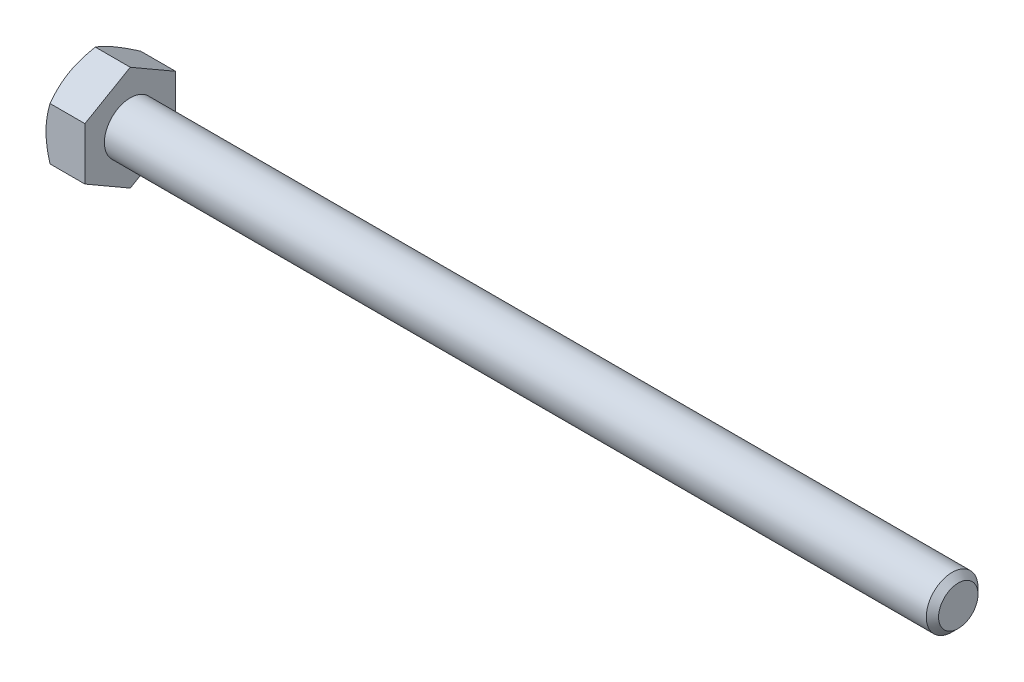
ISO-10303-21;
HEADER;
FILE_DESCRIPTION(('STEP AP214'),'2;1');
FILE_NAME('part.step','',(''),(''),'','','');
FILE_SCHEMA(('AUTOMOTIVE_DESIGN { 1 0 10303 214 1 1 1 1 }'));
ENDSEC;
DATA;
#1=APPLICATION_CONTEXT('core data for automotive mechanical design processes');
#2=APPLICATION_PROTOCOL_DEFINITION('international standard','automotive_design',2000,#1);
#3=PRODUCT_CONTEXT('',#1,'mechanical');
#4=PRODUCT('Part','Part','',(#3));
#5=PRODUCT_RELATED_PRODUCT_CATEGORY('part','',(#4));
#6=PRODUCT_DEFINITION_FORMATION('','',#4);
#7=PRODUCT_DEFINITION_CONTEXT('part definition',#1,'design');
#8=PRODUCT_DEFINITION('design','',#6,#7);
#9=PRODUCT_DEFINITION_SHAPE('','',#8);
#10=(LENGTH_UNIT() NAMED_UNIT(*) SI_UNIT(.MILLI.,.METRE.));
#11=(NAMED_UNIT(*) PLANE_ANGLE_UNIT() SI_UNIT($,.RADIAN.));
#12=(NAMED_UNIT(*) SI_UNIT($,.STERADIAN.) SOLID_ANGLE_UNIT());
#13=UNCERTAINTY_MEASURE_WITH_UNIT(LENGTH_MEASURE(1.E-05),#10,'distance_accuracy_value','');
#14=(GEOMETRIC_REPRESENTATION_CONTEXT(3) GLOBAL_UNCERTAINTY_ASSIGNED_CONTEXT((#13)) GLOBAL_UNIT_ASSIGNED_CONTEXT((#10,
#11,#12)) REPRESENTATION_CONTEXT('',''));
#15=CARTESIAN_POINT('',(0.,0.,0.));
#16=DIRECTION('',(0.,0.,1.));
#17=DIRECTION('',(1.,0.,0.));
#18=AXIS2_PLACEMENT_3D('',#15,#16,#17);
#19=CARTESIAN_POINT('',(4.7752,3.21156860739421,-5.5626));
#20=DIRECTION('',(0.,-0.866025403784438,0.500000000000001));
#21=DIRECTION('',(0.,-0.500000000000002,-0.866025403784438));
#22=AXIS2_PLACEMENT_3D('',#19,#20,#21);
#23=PLANE('',#22);
#24=CARTESIAN_POINT('',(0.496898061070145,6.42325268484227,0.0002));
#25=CARTESIAN_POINT('',(0.456146202255132,6.35265858120791,-0.122072574209491));
#26=CARTESIAN_POINT('',(0.417243775308724,6.2818012683745,-0.244801040124762));
#27=CARTESIAN_POINT('',(0.343647161560544,6.13951120287093,-0.491254662989244));
#28=CARTESIAN_POINT('',(0.308954790139046,6.06807821602766,-0.614980225538198));
#29=CARTESIAN_POINT('',(0.211873701066857,5.8526355064814,-0.988137944592621));
#30=CARTESIAN_POINT('',(0.156654841923374,5.70777535201369,-1.23904309212296));
#31=CARTESIAN_POINT('',(0.0919037861815295,5.49099476252076,-1.61451808721946));
#32=CARTESIAN_POINT('',(0.0734579983429358,5.419722058732,-1.7379660313744));
#33=CARTESIAN_POINT('',(0.0425268916674639,5.27685459691415,-1.98541973399132));
#34=CARTESIAN_POINT('',(0.03004104618901,5.20525986790489,-2.10942544218948));
#35=CARTESIAN_POINT('',(0.0113480299394723,5.06194605565758,-2.35765224642821));
#36=CARTESIAN_POINT('',(0.00513373340584859,4.9902272065059,-2.48187293701928));
#37=CARTESIAN_POINT('',(-0.000889599359094047,4.84672720555796,-2.7304222295473));
#38=CARTESIAN_POINT('',(-0.000698833448294769,4.7749460557547,-2.85475082803225));
#39=CARTESIAN_POINT('',(0.00862810136342433,4.57828637012706,-3.19537539533985));
#40=CARTESIAN_POINT('',(0.0242873955350771,4.4534722013835,-3.41155987710816));
#41=CARTESIAN_POINT('',(0.0739443233816063,4.20467287416474,-3.84249295274001));
#42=CARTESIAN_POINT('',(0.107958931423459,4.08068859075412,-4.05724003094723));
#43=CARTESIAN_POINT('',(0.192986041409677,3.83138850679899,-4.4890404426887));
#44=CARTESIAN_POINT('',(0.244358813937401,3.70610416511176,-4.70603928788379));
#45=CARTESIAN_POINT('',(0.360954456999594,3.45740388365365,-5.13680081122592));
#46=CARTESIAN_POINT('',(0.426149937617058,3.33398475856357,-5.35056900650764));
#47=CARTESIAN_POINT('',(0.496898061070138,3.21145313734037,-5.5628));
#48=B_SPLINE_CURVE_WITH_KNOTS('',3,(#24,#25,#26,#27,#28,#29,#30,#31,#32,#33,#34,#35,#36,#37,#38,
#39,#40,#41,#42,#43,#44,#45,#46,#47),.UNSPECIFIED.,.F.,.F.,(4,2,2,2,2,2,2,2,2,2,2,4),(0.,
0.440820118562271,0.881829648847401,1.76568130465017,2.19678242164486,2.62784543796583,
3.05841812523868,3.48897751176353,4.23854798324166,4.9888128227567,5.75571809391027,
6.52111769989992),.UNSPECIFIED.);
#49=CARTESIAN_POINT('',(0.49683139260579,6.42313721478843,0.));
#50=VERTEX_POINT('',#49);
#51=CARTESIAN_POINT('',(0.,4.81735291109131,-2.78130000000001));
#52=VERTEX_POINT('',#51);
#53=EDGE_CURVE('E47',#50,#52,#48,.T.);
#54=ORIENTED_EDGE('',*,*,#53,.F.);
#55=DIRECTION('',(-1.,0.,0.));
#56=VECTOR('',#55,1.);
#57=CARTESIAN_POINT('',(4.7752,6.42313721478843,0.));
#58=LINE('',#57,#56);
#59=CARTESIAN_POINT('',(4.7752,6.42313721478843,0.));
#60=VERTEX_POINT('',#59);
#61=EDGE_CURVE('E143',#60,#50,#58,.T.);
#62=ORIENTED_EDGE('',*,*,#61,.F.);
#63=DIRECTION('',(0.,0.500000000000001,0.866025403784438));
#64=VECTOR('',#63,1.);
#65=CARTESIAN_POINT('',(4.7752,3.21156860739421,-5.5626));
#66=LINE('',#65,#64);
#67=CARTESIAN_POINT('',(4.7752,3.21156860739421,-5.5626));
#68=VERTEX_POINT('',#67);
#69=EDGE_CURVE('E228',#68,#60,#66,.T.);
#70=ORIENTED_EDGE('',*,*,#69,.F.);
#71=DIRECTION('',(-1.,0.,0.));
#72=VECTOR('',#71,1.);
#73=CARTESIAN_POINT('',(4.7752,3.21156860739421,-5.5626));
#74=LINE('',#73,#72);
#75=CARTESIAN_POINT('',(0.496831392605783,3.21156860739421,-5.5626));
#76=VERTEX_POINT('',#75);
#77=EDGE_CURVE('E131',#68,#76,#74,.T.);
#78=ORIENTED_EDGE('',*,*,#77,.T.);
#79=EDGE_CURVE('E125',#52,#76,#48,.T.);
#80=ORIENTED_EDGE('',*,*,#79,.F.);
#81=EDGE_LOOP('',(#54,#62,#70,#78,#80));
#82=FACE_BOUND('',#81,.T.);
#83=ADVANCED_FACE('F31',(#82),#23,.F.);
#84=CARTESIAN_POINT('',(4.7752,6.42313721478843,0.));
#85=DIRECTION('',(0.,-0.866025403784438,-0.500000000000002));
#86=DIRECTION('',(0.,0.500000000000002,-0.866025403784438));
#87=AXIS2_PLACEMENT_3D('',#84,#85,#86);
#88=PLANE('',#87);
#89=CARTESIAN_POINT('',(0.496898061070137,3.21145313734037,5.5628));
#90=CARTESIAN_POINT('',(0.456146202255125,3.28204724097473,5.44052742579051));
#91=CARTESIAN_POINT('',(0.417243775308718,3.35290455380814,5.31779895987524));
#92=CARTESIAN_POINT('',(0.343647161560539,3.49519461931171,5.07134533701076));
#93=CARTESIAN_POINT('',(0.30895479013904,3.56662760615498,4.9476197744618));
#94=CARTESIAN_POINT('',(0.211873701066851,3.78207031570124,4.57446205540738));
#95=CARTESIAN_POINT('',(0.15665484192337,3.92693047016895,4.32355690787704));
#96=CARTESIAN_POINT('',(0.0919037861815258,4.14371105966188,3.94808191278055));
#97=CARTESIAN_POINT('',(0.0734579983429323,4.21498376345064,3.82463396862561));
#98=CARTESIAN_POINT('',(0.0425268916674611,4.35785122526849,3.57718026600868));
#99=CARTESIAN_POINT('',(0.0300410461890076,4.42944595427775,3.45317455781052));
#100=CARTESIAN_POINT('',(0.0113480299394705,4.57275976652506,3.20494775357179));
#101=CARTESIAN_POINT('',(0.00513373340584691,4.64447861567674,3.08072706298073));
#102=CARTESIAN_POINT('',(-0.000889599359095135,4.78797861662468,2.83217777045271));
#103=CARTESIAN_POINT('',(-0.000698833448295428,4.85975976642794,2.70784917196775));
#104=CARTESIAN_POINT('',(0.00862810136342448,5.05641945205558,2.36722460466016));
#105=CARTESIAN_POINT('',(0.0242873955350775,5.18123362079914,2.15104012289184));
#106=CARTESIAN_POINT('',(0.0739443233816076,5.4300329480179,1.72010704725999));
#107=CARTESIAN_POINT('',(0.107958931423461,5.55401723142852,1.50535996905278));
#108=CARTESIAN_POINT('',(0.192986041409681,5.80331731538366,1.0735595573113));
#109=CARTESIAN_POINT('',(0.244358813937406,5.92860165707088,0.856560712116214));
#110=CARTESIAN_POINT('',(0.360954456999599,6.17730193852899,0.425799188774085));
#111=CARTESIAN_POINT('',(0.426149937617065,6.30072106361907,0.212030993492364));
#112=CARTESIAN_POINT('',(0.496898061070145,6.42325268484227,-0.000200000000000452));
#113=B_SPLINE_CURVE_WITH_KNOTS('',3,(#89,#90,#91,#92,#93,#94,#95,#96,#97,#98,#99,#100,#101,#102,
#103,#104,#105,#106,#107,#108,#109,#110,#111,#112),.UNSPECIFIED.,.F.,.F.,(4,2,2,2,2,2,2,2,2,2,2,
4),(0.,0.440820118562269,0.881829648847399,1.76568130465016,2.19678242164486,2.62784543796583,
3.05841812523867,3.48897751176352,4.23854798324166,4.98881282275669,5.75571809391027,
6.52111769989993),.UNSPECIFIED.);
#114=CARTESIAN_POINT('',(0.496831392605783,3.21156860739421,5.5626));
#115=VERTEX_POINT('',#114);
#116=CARTESIAN_POINT('',(0.,4.81735291109131,2.78130000000001));
#117=VERTEX_POINT('',#116);
#118=EDGE_CURVE('E54',#115,#117,#113,.T.);
#119=ORIENTED_EDGE('',*,*,#118,.F.);
#120=DIRECTION('',(-1.,0.,0.));
#121=VECTOR('',#120,1.);
#122=CARTESIAN_POINT('',(4.7752,3.21156860739421,5.5626));
#123=LINE('',#122,#121);
#124=CARTESIAN_POINT('',(4.7752,3.21156860739421,5.5626));
#125=VERTEX_POINT('',#124);
#126=EDGE_CURVE('E141',#125,#115,#123,.T.);
#127=ORIENTED_EDGE('',*,*,#126,.F.);
#128=DIRECTION('',(0.,-0.500000000000002,0.866025403784438));
#129=VECTOR('',#128,1.);
#130=CARTESIAN_POINT('',(4.7752,6.42313721478843,0.));
#131=LINE('',#130,#129);
#132=EDGE_CURVE('E226',#60,#125,#131,.T.);
#133=ORIENTED_EDGE('',*,*,#132,.F.);
#134=ORIENTED_EDGE('',*,*,#61,.T.);
#135=EDGE_CURVE('E158',#117,#50,#113,.T.);
#136=ORIENTED_EDGE('',*,*,#135,.F.);
#137=EDGE_LOOP('',(#119,#127,#133,#134,#136));
#138=FACE_BOUND('',#137,.T.);
#139=ADVANCED_FACE('F164',(#138),#88,.F.);
#140=CARTESIAN_POINT('',(4.7752,3.21156860739421,5.5626));
#141=DIRECTION('',(0.,0.,-1.));
#142=DIRECTION('',(0.,1.,0.));
#143=AXIS2_PLACEMENT_3D('',#140,#141,#142);
#144=PLANE('',#143);
#145=CARTESIAN_POINT('',(2.76946298118782,-8.73931907134926,5.5626));
#146=CARTESIAN_POINT('',(2.65067477687311,-8.49536496294496,5.5626));
#147=CARTESIAN_POINT('',(2.53299354297042,-8.25086273134791,5.5626));
#148=CARTESIAN_POINT('',(2.30046552320843,-7.7604708971534,5.5626));
#149=CARTESIAN_POINT('',(2.18561916316987,-7.51458109286489,5.5626));
#150=CARTESIAN_POINT('',(1.95882765602869,-7.01990967591007,5.5626));
#151=CARTESIAN_POINT('',(1.8469007539214,-6.77111967039446,5.5626));
#152=CARTESIAN_POINT('',(1.62748022369642,-6.2715995272068,5.5626));
#153=CARTESIAN_POINT('',(1.51998639326666,-6.02086947869407,5.5626));
#154=CARTESIAN_POINT('',(1.30708686305049,-5.50862062515995,5.5626));
#155=CARTESIAN_POINT('',(1.2018721345633,-5.24702202730584,5.5626));
#156=CARTESIAN_POINT('',(0.999136458565238,-4.72080610690395,5.5626));
#157=CARTESIAN_POINT('',(0.901616358276672,-4.45618845560251,5.5626));
#158=CARTESIAN_POINT('',(0.716747076854938,-3.92397402586807,5.5626));
#159=CARTESIAN_POINT('',(0.629378259627776,-3.65638413416904,5.5626));
#160=CARTESIAN_POINT('',(0.467540995367502,-3.11736467394692,5.5626));
#161=CARTESIAN_POINT('',(0.393068603844484,-2.84593630702823,5.5626));
#162=CARTESIAN_POINT('',(0.260913640576687,-2.30059524037529,5.5626));
#163=CARTESIAN_POINT('',(0.203137923933969,-2.02670547196029,5.5626));
#164=CARTESIAN_POINT('',(0.107584140993962,-1.47536640605574,5.5626));
#165=CARTESIAN_POINT('',(0.0698039298235405,-1.19791749361908,5.5626));
#166=CARTESIAN_POINT('',(0.0306329033129829,-0.782024037078651,5.5626));
#167=CARTESIAN_POINT('',(0.0205033244370687,-0.644369603517899,5.5626));
#168=CARTESIAN_POINT('',(0.0060753924948423,-0.368760084714098,5.5626));
#169=CARTESIAN_POINT('',(0.00177648780683643,-0.230805029148983,5.5626));
#170=CARTESIAN_POINT('',(-0.00088241598890318,0.0451740110860491,5.5626));
#171=CARTESIAN_POINT('',(0.000758104200529116,0.183198000728104,5.5626));
#172=CARTESIAN_POINT('',(0.00993570123351545,0.459040077970908,5.5626));
#173=CARTESIAN_POINT('',(0.0174725517322426,0.596858173271942,5.5626));
#174=CARTESIAN_POINT('',(0.0422505226941699,0.924672766545149,5.5626));
#175=CARTESIAN_POINT('',(0.0620998981240967,1.11447655015001,5.5626));
#176=CARTESIAN_POINT('',(0.111925243451362,1.49274005777643,5.5626));
#177=CARTESIAN_POINT('',(0.141902492996073,1.68119960888146,5.5626));
#178=CARTESIAN_POINT('',(0.245441794558736,2.24430469004824,5.5626));
#179=CARTESIAN_POINT('',(0.3325951814541,2.61648783903803,5.5626));
#180=CARTESIAN_POINT('',(0.4845806566888,3.17327423069249,5.5626));
#181=CARTESIAN_POINT('',(0.539535147458612,3.36074033845109,5.5626));
#182=CARTESIAN_POINT('',(0.65536185695369,3.73385345225387,5.5626));
#183=CARTESIAN_POINT('',(0.716234120687406,3.91950044445069,5.5626));
#184=CARTESIAN_POINT('',(0.842902268347435,4.28903173945152,5.5626));
#185=CARTESIAN_POINT('',(0.908696733188397,4.47291653318727,5.5626));
#186=CARTESIAN_POINT('',(1.04441413237549,4.83914664715104,5.5626));
#187=CARTESIAN_POINT('',(1.11433697604312,5.02149200109189,5.5626));
#188=CARTESIAN_POINT('',(1.30616254116174,5.5078879993683,5.5626));
#189=CARTESIAN_POINT('',(1.43118964217263,5.81070521732177,5.5626));
#190=CARTESIAN_POINT('',(1.68847909791363,6.41326146392027,5.5626));
#191=CARTESIAN_POINT('',(1.82074222334613,6.7130001606208,5.5626));
#192=CARTESIAN_POINT('',(2.09080854329268,7.31009692856944,5.5626));
#193=CARTESIAN_POINT('',(2.22861377416229,7.60745407573435,5.5626));
#194=CARTESIAN_POINT('',(2.50845292532567,8.20015103027085,5.5626));
#195=CARTESIAN_POINT('',(2.65048668069894,8.4954909157686,5.5626));
#196=CARTESIAN_POINT('',(2.93809441051761,9.08501121024942,5.5626));
#197=CARTESIAN_POINT('',(3.08367358024025,9.37918907947537,5.5626));
#198=CARTESIAN_POINT('',(3.3774807874048,9.96621951539326,5.5626));
#199=CARTESIAN_POINT('',(3.52570884593012,10.2590720715133,5.5626));
#200=CARTESIAN_POINT('',(3.97349977739061,11.135883002068,5.5626));
#201=CARTESIAN_POINT('',(4.27623214013078,11.7182219913801,5.5626));
#202=CARTESIAN_POINT('',(4.85550678061973,12.8193647778852,5.5626));
#203=CARTESIAN_POINT('',(5.131489866857,13.3384641726992,5.5626));
#204=CARTESIAN_POINT('',(5.68680572725548,14.3749069841369,5.5626));
#205=CARTESIAN_POINT('',(5.96613869990832,14.8922502943533,5.5626));
#206=CARTESIAN_POINT('',(6.52636532569115,15.9238879354022,5.5626));
#207=CARTESIAN_POINT('',(6.80725082971984,16.438186698545,5.5626));
#208=CARTESIAN_POINT('',(7.37092859091901,17.4656872159849,5.5626));
#209=CARTESIAN_POINT('',(7.65372069975336,17.9788890516247,5.5626));
#210=CARTESIAN_POINT('',(7.93720779447483,18.4917042756102,5.5626));
#211=B_SPLINE_CURVE_WITH_KNOTS('',3,(#145,#146,#147,#148,#149,#150,#151,#152,#153,#154,#155,
#156,#157,#158,#159,#160,#161,#162,#163,#164,#165,#166,#167,#168,#169,#170,#171,#172,#173,#174,
#175,#176,#177,#178,#179,#180,#181,#182,#183,#184,#185,#186,#187,#188,#189,#190,#191,#192,#193,
#194,#195,#196,#197,#198,#199,#200,#201,#202,#203,#204,#205,#206,#207,#208,#209,#210),
.UNSPECIFIED.,.F.,.F.,(4,2,2,2,2,2,2,2,2,2,2,2,2,2,2,2,2,2,2,2,2,2,2,2,2,2,2,2,2,2,2,2,4),(0.,
0.814023059457575,1.62816765666496,2.44655638570204,3.26490772451191,4.1107076400708,
4.95660055342857,5.80082897227975,6.64479871831149,7.4839651145243,8.32304147698214,
8.73701667946676,9.15095271433074,9.56492494141957,9.97888127796806,10.5510771655991,
11.1233453766966,12.2684477407956,12.8544603586944,13.4404774339429,14.0263262050101,
14.6121621128824,15.5948602729038,16.577663303757,17.5608308091096,18.5439600191606,
19.5286286861599,20.5133051939663,22.4822323595086,24.2459312012703,26.0097350693916,
27.7677407284946,29.5256111556824),.UNSPECIFIED.);
#212=CARTESIAN_POINT('',(0.496831392605776,-3.21156860739418,5.5626));
#213=VERTEX_POINT('',#212);
#214=CARTESIAN_POINT('',(0.,0.,5.5626));
#215=VERTEX_POINT('',#214);
#216=EDGE_CURVE('E238',#213,#215,#211,.T.);
#217=ORIENTED_EDGE('',*,*,#216,.F.);
#218=DIRECTION('',(-1.,0.,0.));
#219=VECTOR('',#218,1.);
#220=CARTESIAN_POINT('',(4.7752,-3.21156860739418,5.5626));
#221=LINE('',#220,#219);
#222=CARTESIAN_POINT('',(4.7752,-3.21156860739418,5.5626));
#223=VERTEX_POINT('',#222);
#224=EDGE_CURVE('E133',#223,#213,#221,.T.);
#225=ORIENTED_EDGE('',*,*,#224,.F.);
#226=DIRECTION('',(0.,-1.,0.));
#227=VECTOR('',#226,1.);
#228=CARTESIAN_POINT('',(4.7752,3.21156860739421,5.5626));
#229=LINE('',#228,#227);
#230=EDGE_CURVE('E222',#125,#223,#229,.T.);
#231=ORIENTED_EDGE('',*,*,#230,.F.);
#232=ORIENTED_EDGE('',*,*,#126,.T.);
#233=EDGE_CURVE('E180',#215,#115,#211,.T.);
#234=ORIENTED_EDGE('',*,*,#233,.F.);
#235=EDGE_LOOP('',(#217,#225,#231,#232,#234));
#236=FACE_BOUND('',#235,.T.);
#237=ADVANCED_FACE('F244',(#236),#144,.F.);
#238=CARTESIAN_POINT('',(4.7752,-6.42313721478841,0.));
#239=DIRECTION('',(0.,0.866025403784438,-0.500000000000002));
#240=DIRECTION('',(0.,0.500000000000002,0.866025403784438));
#241=AXIS2_PLACEMENT_3D('',#238,#239,#240);
#242=PLANE('',#241);
#243=CARTESIAN_POINT('',(0.496898061070133,-6.42325268484225,-0.000200000000000067));
#244=CARTESIAN_POINT('',(0.45614620225512,-6.35265858120789,0.12207257420949));
#245=CARTESIAN_POINT('',(0.417243775308713,-6.28180126837448,0.244801040124761));
#246=CARTESIAN_POINT('',(0.343647161560533,-6.13951120287091,0.491254662989242));
#247=CARTESIAN_POINT('',(0.308954790139034,-6.06807821602764,0.614980225538195));
#248=CARTESIAN_POINT('',(0.211873701066845,-5.85263550648138,0.988137944592617));
#249=CARTESIAN_POINT('',(0.156654841923363,-5.70777535201367,1.23904309212296));
#250=CARTESIAN_POINT('',(0.0919037861815182,-5.49099476252074,1.61451808721945));
#251=CARTESIAN_POINT('',(0.0734579983429243,-5.41972205873198,1.73796603137439));
#252=CARTESIAN_POINT('',(0.0425268916674522,-5.27685459691413,1.98541973399131));
#253=CARTESIAN_POINT('',(0.0300410461889981,-5.20525986790487,2.10942544218947));
#254=CARTESIAN_POINT('',(0.0113480299394605,-5.06194605565756,2.3576522464282));
#255=CARTESIAN_POINT('',(0.00513373340583685,-4.99022720650589,2.48187293701927));
#256=CARTESIAN_POINT('',(-0.000889599359105341,-4.84672720555794,2.73042222954729));
#257=CARTESIAN_POINT('',(-0.000698833448305768,-4.77494605575468,2.85475082803224));
#258=CARTESIAN_POINT('',(0.00862810136341335,-4.57828637012704,3.19537539533984));
#259=CARTESIAN_POINT('',(0.0242873955350654,-4.45347220138349,3.41155987710815));
#260=CARTESIAN_POINT('',(0.0739443233815945,-4.20467287416472,3.84249295274001));
#261=CARTESIAN_POINT('',(0.107958931423448,-4.0806885907541,4.05724003094722));
#262=CARTESIAN_POINT('',(0.192986041409668,-3.83138850679897,4.48904044268869));
#263=CARTESIAN_POINT('',(0.244358813937392,-3.70610416511174,4.70603928788378));
#264=CARTESIAN_POINT('',(0.360954456999586,-3.45740388365363,5.13680081122591));
#265=CARTESIAN_POINT('',(0.426149937617051,-3.33398475856355,5.35056900650764));
#266=CARTESIAN_POINT('',(0.49689806107013,-3.21145313734035,5.5628));
#267=B_SPLINE_CURVE_WITH_KNOTS('',3,(#243,#244,#245,#246,#247,#248,#249,#250,#251,#252,#253,
#254,#255,#256,#257,#258,#259,#260,#261,#262,#263,#264,#265,#266),.UNSPECIFIED.,.F.,.F.,(4,2,2,
2,2,2,2,2,2,2,2,4),(0.,0.440820118562269,0.881829648847397,1.76568130465016,2.19678242164486,
2.62784543796582,3.05841812523867,3.48897751176352,4.23854798324165,4.98881282275669,
5.75571809391027,6.52111769989993),.UNSPECIFIED.);
#268=CARTESIAN_POINT('',(0.496831392605778,-6.42313721478841,0.));
#269=VERTEX_POINT('',#268);
#270=CARTESIAN_POINT('',(0.,-4.81735291109131,2.78130000000001));
#271=VERTEX_POINT('',#270);
#272=EDGE_CURVE('E166',#269,#271,#267,.T.);
#273=ORIENTED_EDGE('',*,*,#272,.F.);
#274=DIRECTION('',(-1.,0.,0.));
#275=VECTOR('',#274,1.);
#276=CARTESIAN_POINT('',(4.7752,-6.42313721478841,0.));
#277=LINE('',#276,#275);
#278=CARTESIAN_POINT('',(4.7752,-6.42313721478841,0.));
#279=VERTEX_POINT('',#278);
#280=EDGE_CURVE('E130',#279,#269,#277,.T.);
#281=ORIENTED_EDGE('',*,*,#280,.F.);
#282=DIRECTION('',(0.,-0.500000000000002,-0.866025403784438));
#283=VECTOR('',#282,1.);
#284=CARTESIAN_POINT('',(4.7752,-6.42313721478841,0.));
#285=LINE('',#284,#283);
#286=EDGE_CURVE('E220',#223,#279,#285,.T.);
#287=ORIENTED_EDGE('',*,*,#286,.F.);
#288=ORIENTED_EDGE('',*,*,#224,.T.);
#289=EDGE_CURVE('E168',#271,#213,#267,.T.);
#290=ORIENTED_EDGE('',*,*,#289,.F.);
#291=EDGE_LOOP('',(#273,#281,#287,#288,#290));
#292=FACE_BOUND('',#291,.T.);
#293=ADVANCED_FACE('F216',(#292),#242,.F.);
#294=CARTESIAN_POINT('',(4.7752,-3.21156860739421,-5.5626));
#295=DIRECTION('',(0.,0.866025403784439,0.499999999999999));
#296=DIRECTION('',(0.,-0.499999999999999,0.866025403784439));
#297=AXIS2_PLACEMENT_3D('',#294,#295,#296);
#298=PLANE('',#297);
#299=CARTESIAN_POINT('',(0.496898061070139,-3.21145313734037,-5.5628));
#300=CARTESIAN_POINT('',(0.456146202255127,-3.28204724097473,-5.44052742579051));
#301=CARTESIAN_POINT('',(0.417243775308719,-3.35290455380814,-5.31779895987524));
#302=CARTESIAN_POINT('',(0.343647161560539,-3.49519461931171,-5.07134533701076));
#303=CARTESIAN_POINT('',(0.30895479013904,-3.56662760615499,-4.9476197744618));
#304=CARTESIAN_POINT('',(0.211873701066851,-3.78207031570124,-4.57446205540738));
#305=CARTESIAN_POINT('',(0.15665484192337,-3.92693047016895,-4.32355690787704));
#306=CARTESIAN_POINT('',(0.0919037861815247,-4.14371105966188,-3.94808191278054));
#307=CARTESIAN_POINT('',(0.0734579983429302,-4.21498376345064,-3.8246339686256));
#308=CARTESIAN_POINT('',(0.0425268916674584,-4.35785122526849,-3.57718026600868));
#309=CARTESIAN_POINT('',(0.0300410461890051,-4.42944595427775,-3.45317455781052));
#310=CARTESIAN_POINT('',(0.0113480299394679,-4.57275976652506,-3.20494775357179));
#311=CARTESIAN_POINT('',(0.00513373340584384,-4.64447861567673,-3.08072706298072));
#312=CARTESIAN_POINT('',(-0.000889599359098822,-4.78797861662468,-2.8321777704527));
#313=CARTESIAN_POINT('',(-0.00069883344829927,-4.85975976642793,-2.70784917196775));
#314=CARTESIAN_POINT('',(0.00862810136342017,-5.05641945205557,-2.36722460466015));
#315=CARTESIAN_POINT('',(0.0242873955350727,-5.18123362079913,-2.15104012289184));
#316=CARTESIAN_POINT('',(0.073944323381602,-5.43003294801789,-1.72010704725998));
#317=CARTESIAN_POINT('',(0.107958931423455,-5.55401723142851,-1.50535996905277));
#318=CARTESIAN_POINT('',(0.192986041409674,-5.80331731538364,-1.0735595573113));
#319=CARTESIAN_POINT('',(0.244358813937398,-5.92860165707086,-0.856560712116212));
#320=CARTESIAN_POINT('',(0.36095445699959,-6.17730193852897,-0.425799188774083));
#321=CARTESIAN_POINT('',(0.426149937617054,-6.30072106361906,-0.212030993492363));
#322=CARTESIAN_POINT('',(0.496898061070133,-6.42325268484225,0.000200000000000195));
#323=B_SPLINE_CURVE_WITH_KNOTS('',3,(#299,#300,#301,#302,#303,#304,#305,#306,#307,#308,#309,
#310,#311,#312,#313,#314,#315,#316,#317,#318,#319,#320,#321,#322),.UNSPECIFIED.,.F.,.F.,(4,2,2,
2,2,2,2,2,2,2,2,4),(0.,0.44082011856227,0.881829648847399,1.76568130465016,2.19678242164486,
2.62784543796583,3.05841812523868,3.48897751176352,4.23854798324166,4.98881282275669,
5.75571809391027,6.52111769989992),.UNSPECIFIED.);
#324=CARTESIAN_POINT('',(0.496831392605575,-3.21156860739453,-5.5626));
#325=VERTEX_POINT('',#324);
#326=CARTESIAN_POINT('',(0.,-4.81735291109132,-2.78129999999999));
#327=VERTEX_POINT('',#326);
#328=EDGE_CURVE('E107',#325,#327,#323,.T.);
#329=ORIENTED_EDGE('',*,*,#328,.F.);
#330=DIRECTION('',(-1.,0.,0.));
#331=VECTOR('',#330,1.);
#332=CARTESIAN_POINT('',(4.7752,-3.21156860739421,-5.5626));
#333=LINE('',#332,#331);
#334=CARTESIAN_POINT('',(4.7752,-3.21156860739421,-5.5626));
#335=VERTEX_POINT('',#334);
#336=EDGE_CURVE('E121',#335,#325,#333,.T.);
#337=ORIENTED_EDGE('',*,*,#336,.F.);
#338=DIRECTION('',(0.,0.499999999999999,-0.866025403784439));
#339=VECTOR('',#338,1.);
#340=CARTESIAN_POINT('',(4.7752,-3.21156860739421,-5.5626));
#341=LINE('',#340,#339);
#342=EDGE_CURVE('E218',#279,#335,#341,.T.);
#343=ORIENTED_EDGE('',*,*,#342,.F.);
#344=ORIENTED_EDGE('',*,*,#280,.T.);
#345=EDGE_CURVE('E124',#327,#269,#323,.T.);
#346=ORIENTED_EDGE('',*,*,#345,.F.);
#347=EDGE_LOOP('',(#329,#337,#343,#344,#346));
#348=FACE_BOUND('',#347,.T.);
#349=ADVANCED_FACE('F119',(#348),#298,.F.);
#350=CARTESIAN_POINT('',(4.7752,3.21156860739421,-5.5626));
#351=DIRECTION('',(0.,0.,1.));
#352=DIRECTION('',(0.,-1.,0.));
#353=AXIS2_PLACEMENT_3D('',#350,#351,#352);
#354=PLANE('',#353);
#355=CARTESIAN_POINT('',(2.76946298300579,-8.73931907508182,-5.5626));
#356=CARTESIAN_POINT('',(2.65067477861528,-8.49536496655187,-5.5626));
#357=CARTESIAN_POINT('',(2.53299354463683,-8.25086273482909,-5.5626));
#358=CARTESIAN_POINT('',(2.30046552472368,-7.76047090038272,-5.5626));
#359=CARTESIAN_POINT('',(2.18561916460972,-7.51458109596809,-5.5626));
#360=CARTESIAN_POINT('',(1.95882765731771,-7.01990967875913,-5.5626));
#361=CARTESIAN_POINT('',(1.846900755135,-6.77111967311548,-5.5626));
#362=CARTESIAN_POINT('',(1.62748022476042,-6.27159952967088,-5.5626));
#363=CARTESIAN_POINT('',(1.51998639425648,-6.02086948102925,-5.5626));
#364=CARTESIAN_POINT('',(1.30708686388975,-5.50862062722724,-5.5626));
#365=CARTESIAN_POINT('',(1.20187213532635,-5.24702202923405,-5.5626));
#366=CARTESIAN_POINT('',(0.99913645917992,-4.72080610855178,-5.5626));
#367=CARTESIAN_POINT('',(0.901616358819191,-4.45618845710904,-5.5626));
#368=CARTESIAN_POINT('',(0.716747077259988,-3.92397402708937,-5.5626));
#369=CARTESIAN_POINT('',(0.629378259967501,-3.65638413524644,-5.5626));
#370=CARTESIAN_POINT('',(0.467540995587167,-3.11736467473259,-5.5626));
#371=CARTESIAN_POINT('',(0.393068604009408,-2.84593630766609,-5.5626));
#372=CARTESIAN_POINT('',(0.260913640631061,-2.3005952406421,-5.5626));
#373=CARTESIAN_POINT('',(0.203137923936715,-2.02670547200285,-5.5626));
#374=CARTESIAN_POINT('',(0.107584140927261,-1.47536640564425,-5.5626));
#375=CARTESIAN_POINT('',(0.0698039297389958,-1.19791749297779,-5.5626));
#376=CARTESIAN_POINT('',(0.0306329032322217,-0.782024036094227,-5.5626));
#377=CARTESIAN_POINT('',(0.0205033243625259,-0.644369602420758,-5.5626));
#378=CARTESIAN_POINT('',(0.00607539244269881,-0.368760083391737,-5.5626));
#379=CARTESIAN_POINT('',(0.00177648777087203,-0.230805027714118,-5.5626));
#380=CARTESIAN_POINT('',(-0.000882415982739008,0.0451740127451212,-5.5626));
#381=CARTESIAN_POINT('',(0.000758104232646094,0.183198002498879,-5.5626));
#382=CARTESIAN_POINT('',(0.00993570132662366,0.459040079963616,-5.5626));
#383=CARTESIAN_POINT('',(0.0174725518603885,0.596858175374882,-5.5626));
#384=CARTESIAN_POINT('',(0.042250522908457,0.924672768817533,-5.5626));
#385=CARTESIAN_POINT('',(0.062099898387905,1.11447655248113,-5.5626));
#386=CARTESIAN_POINT('',(0.11192524381685,1.49274006022233,-5.5626));
#387=CARTESIAN_POINT('',(0.14190249341372,1.68119961138341,-5.5626));
#388=CARTESIAN_POINT('',(0.245441795133937,2.24430469271527,-5.5626));
#389=CARTESIAN_POINT('',(0.332595182135703,2.61648784181074,-5.5626));
#390=CARTESIAN_POINT('',(0.484580657527371,3.17327423362326,-5.5626));
#391=CARTESIAN_POINT('',(0.539535148349866,3.36074034143568,-5.5626));
#392=CARTESIAN_POINT('',(0.65536185794868,3.73385345534551,-5.5626));
#393=CARTESIAN_POINT('',(0.71623412173345,3.91950044759555,-5.5626));
#394=CARTESIAN_POINT('',(0.842902269493737,4.28903174270241,-5.5626));
#395=CARTESIAN_POINT('',(0.908696734383901,4.47291653649097,-5.5626));
#396=CARTESIAN_POINT('',(1.04441413366767,4.83914665056039,-5.5626));
#397=CARTESIAN_POINT('',(1.11433697738277,5.02149200455406,-5.5626));
#398=CARTESIAN_POINT('',(1.30616254258248,5.5078880028608,-5.5626));
#399=CARTESIAN_POINT('',(1.43118964362202,5.8107052207933,-5.5626));
#400=CARTESIAN_POINT('',(1.68847909941208,6.41326146735255,-5.5626));
#401=CARTESIAN_POINT('',(1.82074222486501,6.71300016403479,-5.5626));
#402=CARTESIAN_POINT('',(2.09080854484644,7.31009693194882,-5.5626));
#403=CARTESIAN_POINT('',(2.22861377573049,7.60745407909739,-5.5626));
#404=CARTESIAN_POINT('',(2.50845292691854,8.20015103360299,-5.5626));
#405=CARTESIAN_POINT('',(2.65048668230202,8.49549091908616,-5.5626));
#406=CARTESIAN_POINT('',(2.93809441213761,9.08501121353829,-5.5626));
#407=CARTESIAN_POINT('',(3.08367358186692,9.37918908275012,-5.5626));
#408=CARTESIAN_POINT('',(3.37748078904248,9.96621951864084,-5.5626));
#409=CARTESIAN_POINT('',(3.52570884757214,10.2590720747479,-5.5626));
#410=CARTESIAN_POINT('',(3.97349977904316,11.1358830052649,-5.5626));
#411=CARTESIAN_POINT('',(4.27623214178692,11.7182219945536,-5.5626));
#412=CARTESIAN_POINT('',(4.85550678228881,12.8193647810355,-5.5626));
#413=CARTESIAN_POINT('',(5.13148986853601,13.3384641758492,-5.5626));
#414=CARTESIAN_POINT('',(5.68680572895232,14.3749069872875,-5.5626));
#415=CARTESIAN_POINT('',(5.96613870161306,14.8922502975047,-5.5626));
#416=CARTESIAN_POINT('',(6.52636532741208,15.9238879385591,-5.5626));
#417=CARTESIAN_POINT('',(6.80725083144907,16.4381867017065,-5.5626));
#418=CARTESIAN_POINT('',(7.37092859266394,17.4656872191565,-5.5626));
#419=CARTESIAN_POINT('',(7.65372070150567,17.9788890548015,-5.5626));
#420=CARTESIAN_POINT('',(7.93720779623423,18.4917042787924,-5.5626));
#421=B_SPLINE_CURVE_WITH_KNOTS('',3,(#355,#356,#357,#358,#359,#360,#361,#362,#363,#364,#365,
#366,#367,#368,#369,#370,#371,#372,#373,#374,#375,#376,#377,#378,#379,#380,#381,#382,#383,#384,
#385,#386,#387,#388,#389,#390,#391,#392,#393,#394,#395,#396,#397,#398,#399,#400,#401,#402,#403,
#404,#405,#406,#407,#408,#409,#410,#411,#412,#413,#414,#415,#416,#417,#418,#419,#420),
.UNSPECIFIED.,.F.,.F.,(4,2,2,2,2,2,2,2,2,2,2,2,2,2,2,2,2,2,2,2,2,2,2,2,2,2,2,2,2,2,2,2,4),(0.,
0.814023059896039,1.62816765754195,2.44655638702216,3.26490772627512,4.11070764230638,
4.95660055613668,5.80082897545884,6.6447987219612,7.48396511886283,8.32304148200849,
8.7370166848287,9.15095272002818,9.56492494745272,9.97888128433687,10.5510771721585,
11.1233453834466,12.2684477479276,12.8544603660259,13.4404774414739,14.0263262127401,
14.6121621208114,15.5948602808078,16.5776633116356,17.5608308169621,18.5439600269871,
19.5286286939573,20.5133052017346,22.4822323672198,24.245931208995,26.0097350771296,
27.7677407362569,29.5256111634693),.UNSPECIFIED.);
#422=CARTESIAN_POINT('',(0.,0.,-5.5626));
#423=VERTEX_POINT('',#422);
#424=EDGE_CURVE('E113',#76,#423,#421,.F.);
#425=ORIENTED_EDGE('',*,*,#424,.F.);
#426=ORIENTED_EDGE('',*,*,#77,.F.);
#427=DIRECTION('',(0.,1.,0.));
#428=VECTOR('',#427,1.);
#429=CARTESIAN_POINT('',(4.7752,3.21156860739421,-5.5626));
#430=LINE('',#429,#428);
#431=EDGE_CURVE('E129',#335,#68,#430,.T.);
#432=ORIENTED_EDGE('',*,*,#431,.F.);
#433=ORIENTED_EDGE('',*,*,#336,.T.);
#434=EDGE_CURVE('E104',#423,#325,#421,.F.);
#435=ORIENTED_EDGE('',*,*,#434,.F.);
#436=EDGE_LOOP('',(#425,#426,#432,#433,#435));
#437=FACE_BOUND('',#436,.T.);
#438=ADVANCED_FACE('F127',(#437),#354,.F.);
#439=CARTESIAN_POINT('',(4.7752,6.42313721478843,0.));
#440=DIRECTION('',(1.,0.,0.));
#441=DIRECTION('',(0.,0.,-1.));
#442=AXIS2_PLACEMENT_3D('',#439,#440,#441);
#443=PLANE('',#442);
#444=ORIENTED_EDGE('',*,*,#69,.T.);
#445=ORIENTED_EDGE('',*,*,#132,.T.);
#446=ORIENTED_EDGE('',*,*,#230,.T.);
#447=ORIENTED_EDGE('',*,*,#286,.T.);
#448=ORIENTED_EDGE('',*,*,#342,.T.);
#449=ORIENTED_EDGE('',*,*,#431,.T.);
#450=EDGE_LOOP('',(#444,#445,#446,#447,#448,#449));
#451=FACE_BOUND('',#450,.T.);
#452=CARTESIAN_POINT('',(4.7752,0.,0.));
#453=DIRECTION('',(1.,0.,0.));
#454=DIRECTION('',(0.,0.,-1.));
#455=AXIS2_PLACEMENT_3D('',#452,#453,#454);
#456=CIRCLE('',#455,3.175);
#457=CARTESIAN_POINT('',(4.7752,0.,-3.175));
#458=VERTEX_POINT('',#457);
#459=EDGE_CURVE('E231',#458,#458,#456,.F.);
#460=ORIENTED_EDGE('',*,*,#459,.T.);
#461=EDGE_LOOP('',(#460));
#462=FACE_BOUND('',#461,.T.);
#463=ADVANCED_FACE('F246',(#451,#462),#443,.T.);
#464=CARTESIAN_POINT('',(0.,0.,0.));
#465=DIRECTION('',(-1.,0.,0.));
#466=DIRECTION('',(0.,0.,1.));
#467=AXIS2_PLACEMENT_3D('',#464,#465,#466);
#468=CYLINDRICAL_SURFACE('',#467,3.175);
#469=ORIENTED_EDGE('',*,*,#459,.F.);
#470=EDGE_LOOP('',(#469));
#471=FACE_BOUND('',#470,.T.);
#472=CARTESIAN_POINT('',(105.61955,0.,0.));
#473=DIRECTION('',(-1.,0.,0.));
#474=DIRECTION('',(0.,0.,1.));
#475=AXIS2_PLACEMENT_3D('',#472,#473,#474);
#476=CIRCLE('',#475,3.175);
#477=CARTESIAN_POINT('',(105.61955,0.,3.175));
#478=VERTEX_POINT('',#477);
#479=EDGE_CURVE('E234',#478,#478,#476,.T.);
#480=ORIENTED_EDGE('',*,*,#479,.T.);
#481=EDGE_LOOP('',(#480));
#482=FACE_BOUND('',#481,.T.);
#483=ADVANCED_FACE('F278',(#471,#482),#468,.T.);
#484=CARTESIAN_POINT('',(106.3752,0.,0.));
#485=DIRECTION('',(-1.,0.,0.));
#486=DIRECTION('',(0.,0.,1.));
#487=AXIS2_PLACEMENT_3D('',#484,#485,#486);
#488=CONICAL_SURFACE('',#487,2.41935,0.785398163397432);
#489=ORIENTED_EDGE('',*,*,#479,.F.);
#490=EDGE_LOOP('',(#489));
#491=FACE_BOUND('',#490,.T.);
#492=CARTESIAN_POINT('',(106.3752,0.,0.));
#493=DIRECTION('',(-1.,0.,0.));
#494=DIRECTION('',(0.,0.,1.));
#495=AXIS2_PLACEMENT_3D('',#492,#493,#494);
#496=CIRCLE('',#495,2.41935);
#497=CARTESIAN_POINT('',(106.3752,0.,2.41935));
#498=VERTEX_POINT('',#497);
#499=EDGE_CURVE('E236',#498,#498,#496,.T.);
#500=ORIENTED_EDGE('',*,*,#499,.T.);
#501=EDGE_LOOP('',(#500));
#502=FACE_BOUND('',#501,.T.);
#503=ADVANCED_FACE('F280',(#491,#502),#488,.T.);
#504=CARTESIAN_POINT('',(106.3752,0.,0.));
#505=DIRECTION('',(-1.,0.,0.));
#506=DIRECTION('',(0.,0.,1.));
#507=AXIS2_PLACEMENT_3D('',#504,#505,#506);
#508=PLANE('',#507);
#509=ORIENTED_EDGE('',*,*,#499,.F.);
#510=EDGE_LOOP('',(#509));
#511=FACE_BOUND('',#510,.T.);
#512=ADVANCED_FACE('F193',(#511),#508,.F.);
#513=CARTESIAN_POINT('',(0.,0.,0.));
#514=DIRECTION('',(1.,0.,0.));
#515=DIRECTION('',(0.,0.,-1.));
#516=AXIS2_PLACEMENT_3D('',#513,#514,#515);
#517=CONICAL_SURFACE('',#516,5.5626,1.0471975511966);
#518=ORIENTED_EDGE('',*,*,#328,.T.);
#519=CARTESIAN_POINT('',(0.,0.,0.));
#520=DIRECTION('',(1.,0.,0.));
#521=DIRECTION('',(0.,0.,-1.));
#522=AXIS2_PLACEMENT_3D('',#519,#520,#521);
#523=CIRCLE('',#522,5.5626);
#524=EDGE_CURVE('E35',#327,#423,#523,.T.);
#525=ORIENTED_EDGE('',*,*,#524,.T.);
#526=ORIENTED_EDGE('',*,*,#434,.T.);
#527=EDGE_LOOP('',(#518,#525,#526));
#528=FACE_BOUND('',#527,.T.);
#529=ADVANCED_FACE('F106',(#528),#517,.T.);
#530=ORIENTED_EDGE('',*,*,#272,.T.);
#531=EDGE_CURVE('E148',#271,#327,#523,.T.);
#532=ORIENTED_EDGE('',*,*,#531,.T.);
#533=ORIENTED_EDGE('',*,*,#345,.T.);
#534=EDGE_LOOP('',(#530,#532,#533));
#535=FACE_BOUND('',#534,.T.);
#536=ADVANCED_FACE('F192',(#535),#517,.T.);
#537=ORIENTED_EDGE('',*,*,#216,.T.);
#538=EDGE_CURVE('E149',#215,#271,#523,.T.);
#539=ORIENTED_EDGE('',*,*,#538,.T.);
#540=ORIENTED_EDGE('',*,*,#289,.T.);
#541=EDGE_LOOP('',(#537,#539,#540));
#542=FACE_BOUND('',#541,.T.);
#543=ADVANCED_FACE('F187',(#542),#517,.T.);
#544=ORIENTED_EDGE('',*,*,#233,.T.);
#545=ORIENTED_EDGE('',*,*,#118,.T.);
#546=CARTESIAN_POINT('',(0.,0.,0.));
#547=DIRECTION('',(-1.,0.,0.));
#548=DIRECTION('',(0.,0.,1.));
#549=AXIS2_PLACEMENT_3D('',#546,#547,#548);
#550=CIRCLE('',#549,5.5626);
#551=EDGE_CURVE('E114',#215,#117,#550,.T.);
#552=ORIENTED_EDGE('',*,*,#551,.F.);
#553=EDGE_LOOP('',(#544,#545,#552));
#554=FACE_BOUND('',#553,.T.);
#555=ADVANCED_FACE('F191',(#554),#517,.T.);
#556=ORIENTED_EDGE('',*,*,#135,.T.);
#557=ORIENTED_EDGE('',*,*,#53,.T.);
#558=EDGE_CURVE('E40',#52,#117,#523,.T.);
#559=ORIENTED_EDGE('',*,*,#558,.T.);
#560=EDGE_LOOP('',(#556,#557,#559));
#561=FACE_BOUND('',#560,.T.);
#562=ADVANCED_FACE('F157',(#561),#517,.T.);
#563=ORIENTED_EDGE('',*,*,#79,.T.);
#564=ORIENTED_EDGE('',*,*,#424,.T.);
#565=EDGE_CURVE('E11',#423,#52,#523,.T.);
#566=ORIENTED_EDGE('',*,*,#565,.T.);
#567=EDGE_LOOP('',(#563,#564,#566));
#568=FACE_BOUND('',#567,.T.);
#569=ADVANCED_FACE('F250',(#568),#517,.T.);
#570=CARTESIAN_POINT('',(0.,6.42313721478843,0.));
#571=DIRECTION('',(1.,0.,0.));
#572=DIRECTION('',(0.,0.,-1.));
#573=AXIS2_PLACEMENT_3D('',#570,#571,#572);
#574=PLANE('',#573);
#575=ORIENTED_EDGE('',*,*,#565,.F.);
#576=ORIENTED_EDGE('',*,*,#524,.F.);
#577=ORIENTED_EDGE('',*,*,#531,.F.);
#578=ORIENTED_EDGE('',*,*,#538,.F.);
#579=ORIENTED_EDGE('',*,*,#551,.T.);
#580=ORIENTED_EDGE('',*,*,#558,.F.);
#581=EDGE_LOOP('',(#575,#576,#577,#578,#579,#580));
#582=FACE_BOUND('',#581,.T.);
#583=ADVANCED_FACE('F161',(#582),#574,.F.);
#584=CLOSED_SHELL('',(#83,#139,#237,#293,#349,#438,#463,#483,#503,#512,#529,#536,#543,#555,#562,
#569,#583));
#585=MANIFOLD_SOLID_BREP('B2',#584);
#586=ADVANCED_BREP_SHAPE_REPRESENTATION('',(#18,#585),#14);
#587=SHAPE_DEFINITION_REPRESENTATION(#9,#586);
ENDSEC;
END-ISO-10303-21;
